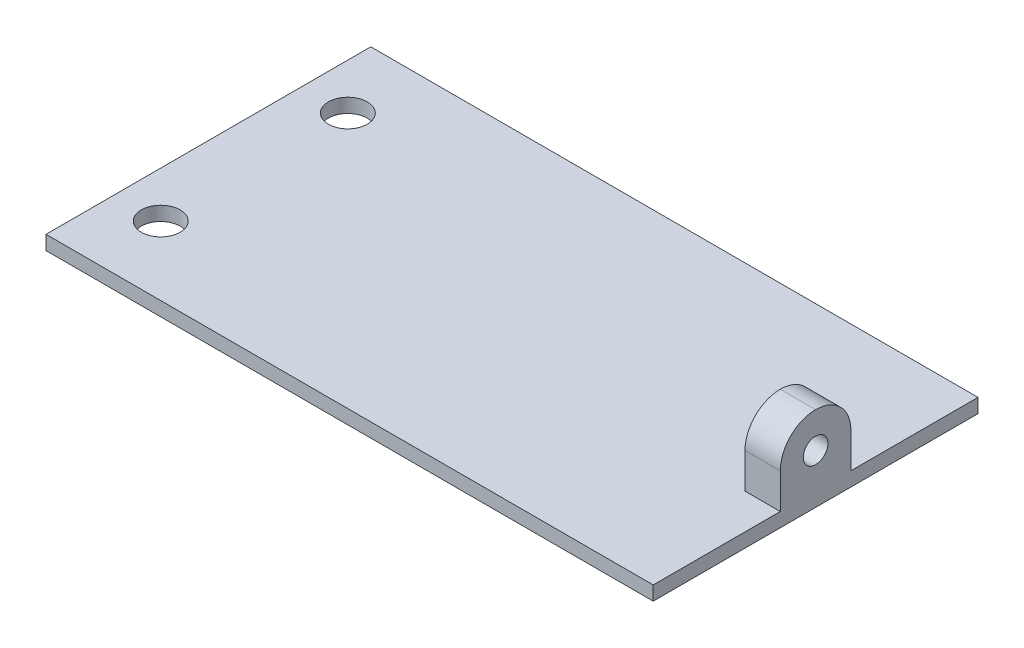
ISO-10303-21;
HEADER;
FILE_DESCRIPTION(('STEP AP214'),'2;1');
FILE_NAME('part.step','',(''),(''),'','','');
FILE_SCHEMA(('AUTOMOTIVE_DESIGN { 1 0 10303 214 1 1 1 1 }'));
ENDSEC;
DATA;
#1=APPLICATION_CONTEXT('core data for automotive mechanical design processes');
#2=APPLICATION_PROTOCOL_DEFINITION('international standard','automotive_design',2000,#1);
#3=PRODUCT_CONTEXT('',#1,'mechanical');
#4=PRODUCT('Part','Part','',(#3));
#5=PRODUCT_RELATED_PRODUCT_CATEGORY('part','',(#4));
#6=PRODUCT_DEFINITION_FORMATION('','',#4);
#7=PRODUCT_DEFINITION_CONTEXT('part definition',#1,'design');
#8=PRODUCT_DEFINITION('design','',#6,#7);
#9=PRODUCT_DEFINITION_SHAPE('','',#8);
#10=(LENGTH_UNIT() NAMED_UNIT(*) SI_UNIT(.MILLI.,.METRE.));
#11=(NAMED_UNIT(*) PLANE_ANGLE_UNIT() SI_UNIT($,.RADIAN.));
#12=(NAMED_UNIT(*) SI_UNIT($,.STERADIAN.) SOLID_ANGLE_UNIT());
#13=UNCERTAINTY_MEASURE_WITH_UNIT(LENGTH_MEASURE(1.E-05),#10,'distance_accuracy_value','');
#14=(GEOMETRIC_REPRESENTATION_CONTEXT(3) GLOBAL_UNCERTAINTY_ASSIGNED_CONTEXT((#13)) GLOBAL_UNIT_ASSIGNED_CONTEXT((#10,
#11,#12)) REPRESENTATION_CONTEXT('',''));
#15=CARTESIAN_POINT('',(0.,0.,0.));
#16=DIRECTION('',(0.,0.,1.));
#17=DIRECTION('',(1.,0.,0.));
#18=AXIS2_PLACEMENT_3D('',#15,#16,#17);
#19=CARTESIAN_POINT('',(0.,2.,0.));
#20=DIRECTION('',(0.,-1.,0.));
#21=DIRECTION('',(0.,0.,-1.));
#22=AXIS2_PLACEMENT_3D('',#19,#20,#21);
#23=PLANE('',#22);
#24=CARTESIAN_POINT('',(-36.5,2.,13.25));
#25=DIRECTION('',(0.,1.,0.));
#26=DIRECTION('',(0.,0.,1.));
#27=AXIS2_PLACEMENT_3D('',#24,#25,#26);
#28=CIRCLE('',#27,2.75);
#29=CARTESIAN_POINT('',(-36.5,2.,16.));
#30=VERTEX_POINT('',#29);
#31=EDGE_CURVE('E153',#30,#30,#28,.T.);
#32=ORIENTED_EDGE('',*,*,#31,.F.);
#33=EDGE_LOOP('',(#32));
#34=FACE_BOUND('',#33,.T.);
#35=CARTESIAN_POINT('',(-36.5,2.,-13.25));
#36=DIRECTION('',(0.,1.,0.));
#37=DIRECTION('',(0.,0.,1.));
#38=AXIS2_PLACEMENT_3D('',#35,#36,#37);
#39=CIRCLE('',#38,2.75);
#40=CARTESIAN_POINT('',(-36.5,2.,-10.5));
#41=VERTEX_POINT('',#40);
#42=EDGE_CURVE('E154',#41,#41,#39,.T.);
#43=ORIENTED_EDGE('',*,*,#42,.F.);
#44=EDGE_LOOP('',(#43));
#45=FACE_BOUND('',#44,.T.);
#46=DIRECTION('',(-1.,0.,0.));
#47=VECTOR('',#46,1.);
#48=CARTESIAN_POINT('',(38.,2.,-5.));
#49=LINE('',#48,#47);
#50=CARTESIAN_POINT('',(43.,2.,-5.));
#51=VERTEX_POINT('',#50);
#52=CARTESIAN_POINT('',(38.,2.,-5.));
#53=VERTEX_POINT('',#52);
#54=EDGE_CURVE('E140',#51,#53,#49,.T.);
#55=ORIENTED_EDGE('',*,*,#54,.F.);
#56=DIRECTION('',(0.,0.,-1.));
#57=VECTOR('',#56,1.);
#58=CARTESIAN_POINT('',(43.,2.,23.));
#59=LINE('',#58,#57);
#60=CARTESIAN_POINT('',(43.,2.,-23.));
#61=VERTEX_POINT('',#60);
#62=EDGE_CURVE('E173',#51,#61,#59,.T.);
#63=ORIENTED_EDGE('',*,*,#62,.T.);
#64=DIRECTION('',(-1.,0.,0.));
#65=VECTOR('',#64,1.);
#66=CARTESIAN_POINT('',(-43.,2.,-23.));
#67=LINE('',#66,#65);
#68=CARTESIAN_POINT('',(-43.,2.,-23.));
#69=VERTEX_POINT('',#68);
#70=EDGE_CURVE('E172',#61,#69,#67,.T.);
#71=ORIENTED_EDGE('',*,*,#70,.T.);
#72=DIRECTION('',(0.,0.,1.));
#73=VECTOR('',#72,1.);
#74=CARTESIAN_POINT('',(-43.,2.,23.));
#75=LINE('',#74,#73);
#76=CARTESIAN_POINT('',(-43.,2.,23.));
#77=VERTEX_POINT('',#76);
#78=EDGE_CURVE('E176',#69,#77,#75,.T.);
#79=ORIENTED_EDGE('',*,*,#78,.T.);
#80=DIRECTION('',(1.,0.,0.));
#81=VECTOR('',#80,1.);
#82=CARTESIAN_POINT('',(-43.,2.,23.));
#83=LINE('',#82,#81);
#84=CARTESIAN_POINT('',(43.,2.,23.));
#85=VERTEX_POINT('',#84);
#86=EDGE_CURVE('E179',#77,#85,#83,.T.);
#87=ORIENTED_EDGE('',*,*,#86,.T.);
#88=CARTESIAN_POINT('',(43.,2.,5.));
#89=VERTEX_POINT('',#88);
#90=EDGE_CURVE('E133',#85,#89,#59,.T.);
#91=ORIENTED_EDGE('',*,*,#90,.T.);
#92=DIRECTION('',(1.,0.,0.));
#93=VECTOR('',#92,1.);
#94=CARTESIAN_POINT('',(43.,2.,5.));
#95=LINE('',#94,#93);
#96=CARTESIAN_POINT('',(38.,2.,5.));
#97=VERTEX_POINT('',#96);
#98=EDGE_CURVE('E117',#97,#89,#95,.T.);
#99=ORIENTED_EDGE('',*,*,#98,.F.);
#100=DIRECTION('',(0.,0.,1.));
#101=VECTOR('',#100,1.);
#102=CARTESIAN_POINT('',(38.,2.,5.));
#103=LINE('',#102,#101);
#104=EDGE_CURVE('E130',#53,#97,#103,.T.);
#105=ORIENTED_EDGE('',*,*,#104,.F.);
#106=EDGE_LOOP('',(#55,#63,#71,#79,#87,#91,#99,#105));
#107=FACE_BOUND('',#106,.T.);
#108=ADVANCED_FACE('F45',(#34,#45,#107),#23,.F.);
#109=CARTESIAN_POINT('',(43.,2.,23.));
#110=DIRECTION('',(-1.,0.,0.));
#111=DIRECTION('',(0.,0.,1.));
#112=AXIS2_PLACEMENT_3D('',#109,#110,#111);
#113=PLANE('',#112);
#114=CARTESIAN_POINT('',(43.,7.,0.));
#115=DIRECTION('',(1.,0.,0.));
#116=DIRECTION('',(0.,0.,-1.));
#117=AXIS2_PLACEMENT_3D('',#114,#115,#116);
#118=CIRCLE('',#117,1.75);
#119=CARTESIAN_POINT('',(43.,7.,-1.75));
#120=VERTEX_POINT('',#119);
#121=EDGE_CURVE('E214',#120,#120,#118,.T.);
#122=ORIENTED_EDGE('',*,*,#121,.F.);
#123=EDGE_LOOP('',(#122));
#124=FACE_BOUND('',#123,.T.);
#125=DIRECTION('',(0.,-1.,0.));
#126=VECTOR('',#125,1.);
#127=CARTESIAN_POINT('',(43.,12.,-5.));
#128=LINE('',#127,#126);
#129=CARTESIAN_POINT('',(43.,7.,-5.));
#130=VERTEX_POINT('',#129);
#131=EDGE_CURVE('E135',#130,#51,#128,.T.);
#132=ORIENTED_EDGE('',*,*,#131,.F.);
#133=CARTESIAN_POINT('',(43.,7.,0.));
#134=DIRECTION('',(-1.,0.,0.));
#135=DIRECTION('',(0.,0.,1.));
#136=AXIS2_PLACEMENT_3D('',#133,#134,#135);
#137=CIRCLE('',#136,5.);
#138=CARTESIAN_POINT('',(43.,12.,0.));
#139=VERTEX_POINT('',#138);
#140=EDGE_CURVE('E55',#130,#139,#137,.F.);
#141=ORIENTED_EDGE('',*,*,#140,.T.);
#142=CARTESIAN_POINT('',(43.,7.,0.));
#143=DIRECTION('',(-1.,0.,0.));
#144=DIRECTION('',(0.,0.,1.));
#145=AXIS2_PLACEMENT_3D('',#142,#143,#144);
#146=CIRCLE('',#145,5.);
#147=CARTESIAN_POINT('',(43.,7.,5.));
#148=VERTEX_POINT('',#147);
#149=EDGE_CURVE('E62',#139,#148,#146,.F.);
#150=ORIENTED_EDGE('',*,*,#149,.T.);
#151=DIRECTION('',(0.,-1.,0.));
#152=VECTOR('',#151,1.);
#153=CARTESIAN_POINT('',(43.,12.,5.));
#154=LINE('',#153,#152);
#155=EDGE_CURVE('E124',#148,#89,#154,.T.);
#156=ORIENTED_EDGE('',*,*,#155,.T.);
#157=ORIENTED_EDGE('',*,*,#90,.F.);
#158=DIRECTION('',(0.,-1.,0.));
#159=VECTOR('',#158,1.);
#160=CARTESIAN_POINT('',(43.,2.,23.));
#161=LINE('',#160,#159);
#162=CARTESIAN_POINT('',(43.,0.,23.));
#163=VERTEX_POINT('',#162);
#164=EDGE_CURVE('E182',#85,#163,#161,.T.);
#165=ORIENTED_EDGE('',*,*,#164,.T.);
#166=DIRECTION('',(0.,0.,-1.));
#167=VECTOR('',#166,1.);
#168=CARTESIAN_POINT('',(43.,0.,23.));
#169=LINE('',#168,#167);
#170=CARTESIAN_POINT('',(43.,0.,-23.));
#171=VERTEX_POINT('',#170);
#172=EDGE_CURVE('E158',#163,#171,#169,.T.);
#173=ORIENTED_EDGE('',*,*,#172,.T.);
#174=DIRECTION('',(0.,-1.,0.));
#175=VECTOR('',#174,1.);
#176=CARTESIAN_POINT('',(43.,2.,-23.));
#177=LINE('',#176,#175);
#178=EDGE_CURVE('E206',#61,#171,#177,.T.);
#179=ORIENTED_EDGE('',*,*,#178,.F.);
#180=ORIENTED_EDGE('',*,*,#62,.F.);
#181=EDGE_LOOP('',(#132,#141,#150,#156,#157,#165,#173,#179,#180));
#182=FACE_BOUND('',#181,.T.);
#183=ADVANCED_FACE('F235',(#124,#182),#113,.F.);
#184=CARTESIAN_POINT('',(-43.,2.,-23.));
#185=DIRECTION('',(0.,0.,1.));
#186=DIRECTION('',(1.,0.,0.));
#187=AXIS2_PLACEMENT_3D('',#184,#185,#186);
#188=PLANE('',#187);
#189=DIRECTION('',(-1.,0.,0.));
#190=VECTOR('',#189,1.);
#191=CARTESIAN_POINT('',(-43.,0.,-23.));
#192=LINE('',#191,#190);
#193=CARTESIAN_POINT('',(-43.,0.,-23.));
#194=VERTEX_POINT('',#193);
#195=EDGE_CURVE('E186',#171,#194,#192,.T.);
#196=ORIENTED_EDGE('',*,*,#195,.T.);
#197=DIRECTION('',(0.,-1.,0.));
#198=VECTOR('',#197,1.);
#199=CARTESIAN_POINT('',(-43.,2.,-23.));
#200=LINE('',#199,#198);
#201=EDGE_CURVE('E202',#69,#194,#200,.T.);
#202=ORIENTED_EDGE('',*,*,#201,.F.);
#203=ORIENTED_EDGE('',*,*,#70,.F.);
#204=ORIENTED_EDGE('',*,*,#178,.T.);
#205=EDGE_LOOP('',(#196,#202,#203,#204));
#206=FACE_BOUND('',#205,.T.);
#207=ADVANCED_FACE('F233',(#206),#188,.F.);
#208=CARTESIAN_POINT('',(-43.,2.,23.));
#209=DIRECTION('',(1.,0.,0.));
#210=DIRECTION('',(0.,0.,-1.));
#211=AXIS2_PLACEMENT_3D('',#208,#209,#210);
#212=PLANE('',#211);
#213=DIRECTION('',(0.,0.,1.));
#214=VECTOR('',#213,1.);
#215=CARTESIAN_POINT('',(-43.,0.,23.));
#216=LINE('',#215,#214);
#217=CARTESIAN_POINT('',(-43.,0.,23.));
#218=VERTEX_POINT('',#217);
#219=EDGE_CURVE('E189',#194,#218,#216,.T.);
#220=ORIENTED_EDGE('',*,*,#219,.T.);
#221=DIRECTION('',(0.,-1.,0.));
#222=VECTOR('',#221,1.);
#223=CARTESIAN_POINT('',(-43.,2.,23.));
#224=LINE('',#223,#222);
#225=EDGE_CURVE('E198',#77,#218,#224,.T.);
#226=ORIENTED_EDGE('',*,*,#225,.F.);
#227=ORIENTED_EDGE('',*,*,#78,.F.);
#228=ORIENTED_EDGE('',*,*,#201,.T.);
#229=EDGE_LOOP('',(#220,#226,#227,#228));
#230=FACE_BOUND('',#229,.T.);
#231=ADVANCED_FACE('F243',(#230),#212,.F.);
#232=CARTESIAN_POINT('',(-43.,2.,23.));
#233=DIRECTION('',(0.,0.,-1.));
#234=DIRECTION('',(-1.,0.,0.));
#235=AXIS2_PLACEMENT_3D('',#232,#233,#234);
#236=PLANE('',#235);
#237=DIRECTION('',(1.,0.,0.));
#238=VECTOR('',#237,1.);
#239=CARTESIAN_POINT('',(-43.,0.,23.));
#240=LINE('',#239,#238);
#241=EDGE_CURVE('E192',#218,#163,#240,.T.);
#242=ORIENTED_EDGE('',*,*,#241,.T.);
#243=ORIENTED_EDGE('',*,*,#164,.F.);
#244=ORIENTED_EDGE('',*,*,#86,.F.);
#245=ORIENTED_EDGE('',*,*,#225,.T.);
#246=EDGE_LOOP('',(#242,#243,#244,#245));
#247=FACE_BOUND('',#246,.T.);
#248=ADVANCED_FACE('F247',(#247),#236,.F.);
#249=CARTESIAN_POINT('',(0.,0.,0.));
#250=DIRECTION('',(0.,-1.,0.));
#251=DIRECTION('',(0.,0.,-1.));
#252=AXIS2_PLACEMENT_3D('',#249,#250,#251);
#253=PLANE('',#252);
#254=CARTESIAN_POINT('',(-36.5,0.,-13.25));
#255=DIRECTION('',(0.,-1.,0.));
#256=DIRECTION('',(0.,0.,-1.));
#257=AXIS2_PLACEMENT_3D('',#254,#255,#256);
#258=CIRCLE('',#257,2.75);
#259=CARTESIAN_POINT('',(-36.5,0.,-16.));
#260=VERTEX_POINT('',#259);
#261=EDGE_CURVE('E159',#260,#260,#258,.F.);
#262=ORIENTED_EDGE('',*,*,#261,.T.);
#263=EDGE_LOOP('',(#262));
#264=FACE_BOUND('',#263,.T.);
#265=CARTESIAN_POINT('',(-36.5,0.,13.25));
#266=DIRECTION('',(0.,-1.,0.));
#267=DIRECTION('',(0.,0.,-1.));
#268=AXIS2_PLACEMENT_3D('',#265,#266,#267);
#269=CIRCLE('',#268,2.75);
#270=CARTESIAN_POINT('',(-36.5,0.,10.5));
#271=VERTEX_POINT('',#270);
#272=EDGE_CURVE('E163',#271,#271,#269,.F.);
#273=ORIENTED_EDGE('',*,*,#272,.T.);
#274=EDGE_LOOP('',(#273));
#275=FACE_BOUND('',#274,.T.);
#276=ORIENTED_EDGE('',*,*,#172,.F.);
#277=ORIENTED_EDGE('',*,*,#241,.F.);
#278=ORIENTED_EDGE('',*,*,#219,.F.);
#279=ORIENTED_EDGE('',*,*,#195,.F.);
#280=EDGE_LOOP('',(#276,#277,#278,#279));
#281=FACE_BOUND('',#280,.T.);
#282=ADVANCED_FACE('F240',(#264,#275,#281),#253,.T.);
#283=CARTESIAN_POINT('',(-36.5,-0.00100000000000013,13.25));
#284=DIRECTION('',(0.,1.,0.));
#285=DIRECTION('',(0.,0.,1.));
#286=AXIS2_PLACEMENT_3D('',#283,#284,#285);
#287=CYLINDRICAL_SURFACE('',#286,2.75);
#288=ORIENTED_EDGE('',*,*,#272,.F.);
#289=EDGE_LOOP('',(#288));
#290=FACE_BOUND('',#289,.T.);
#291=ORIENTED_EDGE('',*,*,#31,.T.);
#292=EDGE_LOOP('',(#291));
#293=FACE_BOUND('',#292,.T.);
#294=ADVANCED_FACE('F296',(#290,#293),#287,.F.);
#295=CARTESIAN_POINT('',(-36.5,-0.00100000000000013,-13.25));
#296=DIRECTION('',(0.,1.,0.));
#297=DIRECTION('',(0.,0.,1.));
#298=AXIS2_PLACEMENT_3D('',#295,#296,#297);
#299=CYLINDRICAL_SURFACE('',#298,2.75);
#300=ORIENTED_EDGE('',*,*,#261,.F.);
#301=EDGE_LOOP('',(#300));
#302=FACE_BOUND('',#301,.T.);
#303=ORIENTED_EDGE('',*,*,#42,.T.);
#304=EDGE_LOOP('',(#303));
#305=FACE_BOUND('',#304,.T.);
#306=ADVANCED_FACE('F293',(#302,#305),#299,.F.);
#307=CARTESIAN_POINT('',(38.,12.,-5.));
#308=DIRECTION('',(0.,0.,1.));
#309=DIRECTION('',(1.,0.,0.));
#310=AXIS2_PLACEMENT_3D('',#307,#308,#309);
#311=PLANE('',#310);
#312=DIRECTION('',(0.,-1.,0.));
#313=VECTOR('',#312,1.);
#314=CARTESIAN_POINT('',(38.,12.,-5.));
#315=LINE('',#314,#313);
#316=CARTESIAN_POINT('',(38.,7.,-5.));
#317=VERTEX_POINT('',#316);
#318=EDGE_CURVE('E123',#317,#53,#315,.T.);
#319=ORIENTED_EDGE('',*,*,#318,.F.);
#320=DIRECTION('',(-1.,0.,0.));
#321=VECTOR('',#320,1.);
#322=CARTESIAN_POINT('',(38.,7.,-5.));
#323=LINE('',#322,#321);
#324=EDGE_CURVE('E220',#317,#130,#323,.F.);
#325=ORIENTED_EDGE('',*,*,#324,.T.);
#326=ORIENTED_EDGE('',*,*,#131,.T.);
#327=ORIENTED_EDGE('',*,*,#54,.T.);
#328=EDGE_LOOP('',(#319,#325,#326,#327));
#329=FACE_BOUND('',#328,.T.);
#330=ADVANCED_FACE('F255',(#329),#311,.F.);
#331=CARTESIAN_POINT('',(38.,12.,5.));
#332=DIRECTION('',(1.,0.,0.));
#333=DIRECTION('',(0.,0.,-1.));
#334=AXIS2_PLACEMENT_3D('',#331,#332,#333);
#335=PLANE('',#334);
#336=CARTESIAN_POINT('',(38.,7.,0.));
#337=DIRECTION('',(1.,0.,0.));
#338=DIRECTION('',(0.,0.,-1.));
#339=AXIS2_PLACEMENT_3D('',#336,#337,#338);
#340=CIRCLE('',#339,1.75);
#341=CARTESIAN_POINT('',(38.,7.,-1.75));
#342=VERTEX_POINT('',#341);
#343=EDGE_CURVE('E143',#342,#342,#340,.T.);
#344=ORIENTED_EDGE('',*,*,#343,.T.);
#345=EDGE_LOOP('',(#344));
#346=FACE_BOUND('',#345,.T.);
#347=CARTESIAN_POINT('',(38.,7.,0.));
#348=DIRECTION('',(1.,0.,0.));
#349=DIRECTION('',(0.,0.,-1.));
#350=AXIS2_PLACEMENT_3D('',#347,#348,#349);
#351=CIRCLE('',#350,5.);
#352=CARTESIAN_POINT('',(38.,7.,5.));
#353=VERTEX_POINT('',#352);
#354=CARTESIAN_POINT('',(38.,12.,0.));
#355=VERTEX_POINT('',#354);
#356=EDGE_CURVE('E210',#353,#355,#351,.F.);
#357=ORIENTED_EDGE('',*,*,#356,.T.);
#358=CARTESIAN_POINT('',(38.,7.,0.));
#359=DIRECTION('',(1.,0.,0.));
#360=DIRECTION('',(0.,0.,-1.));
#361=AXIS2_PLACEMENT_3D('',#358,#359,#360);
#362=CIRCLE('',#361,5.);
#363=EDGE_CURVE('E217',#355,#317,#362,.F.);
#364=ORIENTED_EDGE('',*,*,#363,.T.);
#365=ORIENTED_EDGE('',*,*,#318,.T.);
#366=ORIENTED_EDGE('',*,*,#104,.T.);
#367=DIRECTION('',(0.,-1.,0.));
#368=VECTOR('',#367,1.);
#369=CARTESIAN_POINT('',(38.,12.,5.));
#370=LINE('',#369,#368);
#371=EDGE_CURVE('E114',#353,#97,#370,.T.);
#372=ORIENTED_EDGE('',*,*,#371,.F.);
#373=EDGE_LOOP('',(#357,#364,#365,#366,#372));
#374=FACE_BOUND('',#373,.T.);
#375=ADVANCED_FACE('F137',(#346,#374),#335,.F.);
#376=CARTESIAN_POINT('',(43.,12.,5.));
#377=DIRECTION('',(0.,0.,-1.));
#378=DIRECTION('',(-1.,0.,0.));
#379=AXIS2_PLACEMENT_3D('',#376,#377,#378);
#380=PLANE('',#379);
#381=ORIENTED_EDGE('',*,*,#155,.F.);
#382=DIRECTION('',(1.,0.,0.));
#383=VECTOR('',#382,1.);
#384=CARTESIAN_POINT('',(43.,7.,5.));
#385=LINE('',#384,#383);
#386=EDGE_CURVE('E11',#148,#353,#385,.F.);
#387=ORIENTED_EDGE('',*,*,#386,.T.);
#388=ORIENTED_EDGE('',*,*,#371,.T.);
#389=ORIENTED_EDGE('',*,*,#98,.T.);
#390=EDGE_LOOP('',(#381,#387,#388,#389));
#391=FACE_BOUND('',#390,.T.);
#392=ADVANCED_FACE('F116',(#391),#380,.F.);
#393=CARTESIAN_POINT('',(33.,7.,0.));
#394=DIRECTION('',(1.,0.,0.));
#395=DIRECTION('',(0.,0.,-1.));
#396=AXIS2_PLACEMENT_3D('',#393,#394,#395);
#397=CYLINDRICAL_SURFACE('',#396,1.75);
#398=ORIENTED_EDGE('',*,*,#121,.T.);
#399=EDGE_LOOP('',(#398));
#400=FACE_BOUND('',#399,.T.);
#401=ORIENTED_EDGE('',*,*,#343,.F.);
#402=EDGE_LOOP('',(#401));
#403=FACE_BOUND('',#402,.T.);
#404=ADVANCED_FACE('F262',(#400,#403),#397,.F.);
#405=CARTESIAN_POINT('',(0.,7.,0.));
#406=DIRECTION('',(1.,0.,0.));
#407=DIRECTION('',(0.,0.,-1.));
#408=AXIS2_PLACEMENT_3D('',#405,#406,#407);
#409=CYLINDRICAL_SURFACE('',#408,5.);
#410=ORIENTED_EDGE('',*,*,#386,.F.);
#411=ORIENTED_EDGE('',*,*,#149,.F.);
#412=DIRECTION('',(1.,0.,0.));
#413=VECTOR('',#412,1.);
#414=CARTESIAN_POINT('',(0.,12.,0.));
#415=LINE('',#414,#413);
#416=EDGE_CURVE('E49',#355,#139,#415,.T.);
#417=ORIENTED_EDGE('',*,*,#416,.F.);
#418=ORIENTED_EDGE('',*,*,#356,.F.);
#419=EDGE_LOOP('',(#410,#411,#417,#418));
#420=FACE_BOUND('',#419,.T.);
#421=ADVANCED_FACE('F47',(#420),#409,.T.);
#422=CARTESIAN_POINT('',(0.,7.,0.));
#423=DIRECTION('',(-1.,0.,0.));
#424=DIRECTION('',(0.,0.,1.));
#425=AXIS2_PLACEMENT_3D('',#422,#423,#424);
#426=CYLINDRICAL_SURFACE('',#425,5.);
#427=ORIENTED_EDGE('',*,*,#140,.F.);
#428=ORIENTED_EDGE('',*,*,#324,.F.);
#429=ORIENTED_EDGE('',*,*,#363,.F.);
#430=ORIENTED_EDGE('',*,*,#416,.T.);
#431=EDGE_LOOP('',(#427,#428,#429,#430));
#432=FACE_BOUND('',#431,.T.);
#433=ADVANCED_FACE('F256',(#432),#426,.T.);
#434=CLOSED_SHELL('',(#108,#183,#207,#231,#248,#282,#294,#306,#330,#375,#392,#404,#421,#433));
#435=MANIFOLD_SOLID_BREP('B2',#434);
#436=ADVANCED_BREP_SHAPE_REPRESENTATION('',(#18,#435),#14);
#437=SHAPE_DEFINITION_REPRESENTATION(#9,#436);
ENDSEC;
END-ISO-10303-21;
